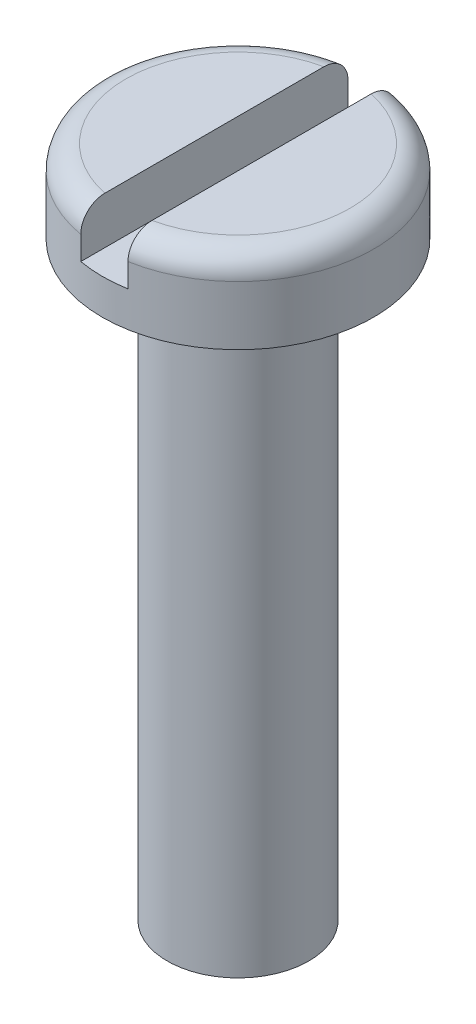
ISO-10303-21;
HEADER;
FILE_DESCRIPTION(('STEP AP214'),'2;1');
FILE_NAME('part.step','',(''),(''),'','','');
FILE_SCHEMA(('AUTOMOTIVE_DESIGN { 1 0 10303 214 1 1 1 1 }'));
ENDSEC;
DATA;
#1=APPLICATION_CONTEXT('core data for automotive mechanical design processes');
#2=APPLICATION_PROTOCOL_DEFINITION('international standard','automotive_design',2000,#1);
#3=PRODUCT_CONTEXT('',#1,'mechanical');
#4=PRODUCT('Part','Part','',(#3));
#5=PRODUCT_RELATED_PRODUCT_CATEGORY('part','',(#4));
#6=PRODUCT_DEFINITION_FORMATION('','',#4);
#7=PRODUCT_DEFINITION_CONTEXT('part definition',#1,'design');
#8=PRODUCT_DEFINITION('design','',#6,#7);
#9=PRODUCT_DEFINITION_SHAPE('','',#8);
#10=(LENGTH_UNIT() NAMED_UNIT(*) SI_UNIT(.MILLI.,.METRE.));
#11=(NAMED_UNIT(*) PLANE_ANGLE_UNIT() SI_UNIT($,.RADIAN.));
#12=(NAMED_UNIT(*) SI_UNIT($,.STERADIAN.) SOLID_ANGLE_UNIT());
#13=UNCERTAINTY_MEASURE_WITH_UNIT(LENGTH_MEASURE(1.E-05),#10,'distance_accuracy_value','');
#14=(GEOMETRIC_REPRESENTATION_CONTEXT(3) GLOBAL_UNCERTAINTY_ASSIGNED_CONTEXT((#13)) GLOBAL_UNIT_ASSIGNED_CONTEXT((#10,
#11,#12)) REPRESENTATION_CONTEXT('',''));
#15=CARTESIAN_POINT('',(0.,0.,0.));
#16=DIRECTION('',(0.,0.,1.));
#17=DIRECTION('',(1.,0.,0.));
#18=AXIS2_PLACEMENT_3D('',#15,#16,#17);
#19=CARTESIAN_POINT('',(0.,3.5,0.));
#20=DIRECTION('',(0.,1.,0.));
#21=DIRECTION('',(0.,0.,1.));
#22=AXIS2_PLACEMENT_3D('',#19,#20,#21);
#23=PLANE('',#22);
#24=DIRECTION('',(0.,0.,-1.));
#25=VECTOR('',#24,1.);
#26=CARTESIAN_POINT('',(0.999999999999999,3.5,-6.56842896440374));
#27=LINE('',#26,#25);
#28=CARTESIAN_POINT('',(1.,3.5,4.64354390525168));
#29=VERTEX_POINT('',#28);
#30=CARTESIAN_POINT('',(0.999999999999999,3.5,-4.64354390525168));
#31=VERTEX_POINT('',#30);
#32=EDGE_CURVE('E88',#29,#31,#27,.T.);
#33=ORIENTED_EDGE('',*,*,#32,.F.);
#34=CARTESIAN_POINT('',(0.,3.5,0.));
#35=DIRECTION('',(0.,1.,0.));
#36=DIRECTION('',(0.,0.,1.));
#37=AXIS2_PLACEMENT_3D('',#34,#35,#36);
#38=CIRCLE('',#37,4.75);
#39=EDGE_CURVE('E99',#29,#31,#38,.T.);
#40=ORIENTED_EDGE('',*,*,#39,.T.);
#41=EDGE_LOOP('',(#33,#40));
#42=FACE_BOUND('',#41,.T.);
#43=ADVANCED_FACE('F33',(#42),#23,.T.);
#44=CARTESIAN_POINT('',(0.,2.5,0.));
#45=DIRECTION('',(0.,1.,0.));
#46=DIRECTION('',(0.,0.,1.));
#47=AXIS2_PLACEMENT_3D('',#44,#45,#46);
#48=TOROIDAL_SURFACE('',#47,4.75,1.);
#49=CARTESIAN_POINT('',(0.999999999999999,3.06518472288821,-5.48454445175744));
#50=CARTESIAN_POINT('',(0.999999999999999,3.01954968627423,-5.51632168081333));
#51=CARTESIAN_POINT('',(0.999999999999999,2.97122176580344,-5.54429670384576));
#52=CARTESIAN_POINT('',(0.999999999999999,2.87052300378599,-5.59177173987451));
#53=CARTESIAN_POINT('',(0.999999999999999,2.81814798636274,-5.61126285771096));
#54=CARTESIAN_POINT('',(0.999999999999999,2.71086408957968,-5.64114752127945));
#55=CARTESIAN_POINT('',(0.999999999999999,2.65595551567557,-5.65154216071787));
#56=CARTESIAN_POINT('',(0.999999999999999,2.54518448016182,-5.66291240594177));
#57=CARTESIAN_POINT('',(0.999999999999999,2.4893222383615,-5.66389015361541));
#58=CARTESIAN_POINT('',(0.999999999999999,2.37849331439132,-5.65642085650966));
#59=CARTESIAN_POINT('',(0.999999999999999,2.32352367782358,-5.64801756400862));
#60=CARTESIAN_POINT('',(0.999999999999999,2.21577194946865,-5.62211242258252));
#61=CARTESIAN_POINT('',(0.999999999999999,2.16298991081687,-5.60461035279348));
#62=CARTESIAN_POINT('',(0.999999999999999,2.0610247759472,-5.56100743028041));
#63=CARTESIAN_POINT('',(0.999999999999999,2.01184658194587,-5.53489512123562));
#64=CARTESIAN_POINT('',(0.999999999999999,1.91851889314154,-5.47485766532985));
#65=CARTESIAN_POINT('',(0.999999999999999,1.8743695623989,-5.44093226368558));
#66=CARTESIAN_POINT('',(0.999999999999999,1.79189356351289,-5.36590889999613));
#67=CARTESIAN_POINT('',(0.999999999999999,1.75362545746599,-5.32474658423208));
#68=CARTESIAN_POINT('',(0.999999999999999,1.68441657733231,-5.23666738131402));
#69=CARTESIAN_POINT('',(0.999999999999999,1.6534763049241,-5.18975010049685));
#70=CARTESIAN_POINT('',(0.999999999999999,1.59927518364256,-5.0907155278223));
#71=CARTESIAN_POINT('',(0.999999999999999,1.57614195480095,-5.0385284077101));
#72=CARTESIAN_POINT('',(0.999999999999999,1.53878893274384,-4.93105755655334));
#73=CARTESIAN_POINT('',(0.999999999999999,1.52456998668383,-4.87577353174279));
#74=CARTESIAN_POINT('',(0.999999999999999,1.5051822533275,-4.76260232896777));
#75=CARTESIAN_POINT('',(0.999999999999999,1.50018316568881,-4.70468606884549));
#76=CARTESIAN_POINT('',(0.999999999999999,1.49982668625646,-4.58882312647553));
#77=CARTESIAN_POINT('',(0.999999999999999,1.50447021559167,-4.53087644185015));
#78=CARTESIAN_POINT('',(0.999999999999999,1.52337973144597,-4.41569637320298));
#79=CARTESIAN_POINT('',(0.999999999999999,1.53778624027629,-4.35848601566789));
#80=CARTESIAN_POINT('',(0.999999999999999,1.57596841394595,-4.24727784289789));
#81=CARTESIAN_POINT('',(0.999999999999999,1.59974460663811,-4.19328020885306));
#82=CARTESIAN_POINT('',(0.999999999999999,1.65612684731109,-4.08990418454262));
#83=CARTESIAN_POINT('',(1.,1.68875781142681,-4.04053936608148));
#84=CARTESIAN_POINT('',(1.,1.7619681588511,-3.94809741266671));
#85=CARTESIAN_POINT('',(1.,1.80254709277508,-3.90501992246271));
#86=CARTESIAN_POINT('',(1.,1.88985796269059,-3.82716906987331));
#87=CARTESIAN_POINT('',(1.,1.93648153337223,-3.79227430729834));
#88=CARTESIAN_POINT('',(1.,2.0350805603147,-3.73110761237692));
#89=CARTESIAN_POINT('',(1.,2.08705493349787,-3.7048339394914));
#90=CARTESIAN_POINT('',(1.,2.19312756687076,-3.66254850272995));
#91=CARTESIAN_POINT('',(1.,2.24710734092197,-3.64623953943972));
#92=CARTESIAN_POINT('',(1.,2.35707329143634,-3.62321416541616));
#93=CARTESIAN_POINT('',(1.,2.4130590648611,-3.61649583872142));
#94=CARTESIAN_POINT('',(1.,2.52374735074063,-3.61295578575569));
#95=CARTESIAN_POINT('',(1.,2.57844124925329,-3.61585890379303));
#96=CARTESIAN_POINT('',(1.,2.68655138587551,-3.63085110811072));
#97=CARTESIAN_POINT('',(1.,2.73996767930503,-3.64293979591295));
#98=CARTESIAN_POINT('',(1.,2.84381082030088,-3.67580475312142));
#99=CARTESIAN_POINT('',(1.,2.89424890871946,-3.69654560600705));
#100=CARTESIAN_POINT('',(1.,2.99103690637796,-3.74601752888342));
#101=CARTESIAN_POINT('',(1.,3.03738641527001,-3.77474938019994));
#102=CARTESIAN_POINT('',(1.,3.1258319672709,-3.84004665926685));
#103=CARTESIAN_POINT('',(1.,3.16780754779184,-3.87677513012849));
#104=CARTESIAN_POINT('',(1.,3.245239463632,-3.95655712734411));
#105=CARTESIAN_POINT('',(1.,3.28069474096664,-3.99961167813271));
#106=CARTESIAN_POINT('',(1.,3.34528001746797,-4.09232841088008));
#107=CARTESIAN_POINT('',(0.999999999999999,3.37416733856303,-4.14215971294858));
#108=CARTESIAN_POINT('',(0.999999999999999,3.42338411206135,-4.2458840316384));
#109=CARTESIAN_POINT('',(0.999999999999999,3.44371241891562,-4.29977759081982));
#110=CARTESIAN_POINT('',(0.999999999999999,3.47565661984185,-4.41142097380307));
#111=CARTESIAN_POINT('',(0.999999999999999,3.48706379065847,-4.46923063356689));
#112=CARTESIAN_POINT('',(0.999999999999999,3.50005928403218,-4.58594356511564));
#113=CARTESIAN_POINT('',(0.999999999999999,3.50164753355147,-4.64484684503218));
#114=CARTESIAN_POINT('',(0.999999999999999,3.49490165828981,-4.76233599074706));
#115=CARTESIAN_POINT('',(0.999999999999999,3.48652567543077,-4.82091947157813));
#116=CARTESIAN_POINT('',(0.999999999999999,3.45994341769148,-4.93583170908549));
#117=CARTESIAN_POINT('',(0.999999999999999,3.44173513251262,-4.99216000213859));
#118=CARTESIAN_POINT('',(0.999999999999999,3.39618095507857,-5.10029117723591));
#119=CARTESIAN_POINT('',(0.999999999999999,3.36893311099196,-5.15213539954179));
#120=CARTESIAN_POINT('',(0.999999999999999,3.30598358386524,-5.25034979661229));
#121=CARTESIAN_POINT('',(0.999999999999999,3.2702930014888,-5.29672704049399));
#122=CARTESIAN_POINT('',(0.999999999999999,3.2060377971303,-5.36674412105525));
#123=CARTESIAN_POINT('',(0.999999999999999,3.17969941018013,-5.39246165054664));
#124=CARTESIAN_POINT('',(0.999999999999999,3.12436141457548,-5.44085511998556));
#125=CARTESIAN_POINT('',(0.999999999999999,3.09536183958906,-5.46353109840438));
#126=CARTESIAN_POINT('',(0.999999999999999,3.06518472288821,-5.48454445175744));
#127=B_SPLINE_CURVE_WITH_KNOTS('',3,(#49,#50,#51,#52,#53,#54,#55,#56,#57,#58,#59,#60,#61,#62,
#63,#64,#65,#66,#67,#68,#69,#70,#71,#72,#73,#74,#75,#76,#77,#78,#79,#80,#81,#82,#83,#84,#85,#86,
#87,#88,#89,#90,#91,#92,#93,#94,#95,#96,#97,#98,#99,#100,#101,#102,#103,#104,#105,#106,#107,
#108,#109,#110,#111,#112,#113,#114,#115,#116,#117,#118,#119,#120,#121,#122,#123,#124,#125,#126),
.UNSPECIFIED.,.T.,.F.,(4,2,2,2,2,2,2,2,2,2,2,2,2,2,2,2,2,2,2,2,2,2,2,2,2,2,2,2,2,2,2,2,2,2,2,2,
2,2,4),(0.,0.166694107861553,0.333562571732808,0.500410969576235,0.667221416569529,
0.833257113838222,0.999296841650093,1.1655583905031,1.33182536187798,1.49965344402201,
1.66749301270237,1.83795653555284,2.00843625569365,2.18202364011152,2.35562760754893,
2.53178493708227,2.70795219207739,2.88462039251338,3.06127860686971,3.23512145829127,
3.4089291904032,3.57726158854158,3.74556035350755,3.90908808300962,4.07260871893973,
4.23546647221079,4.39834015462008,4.56491172225542,4.73151029399709,4.90351669462979,
5.07554610949784,5.25148909886218,5.42743339697243,5.60411942519863,5.78084159208583,
5.95570639731922,6.13034255271767,6.24057389146693,6.35080383581503),.UNSPECIFIED.);
#128=CARTESIAN_POINT('',(0.999999999999999,2.49999999999999,-5.66237582645312));
#129=VERTEX_POINT('',#128);
#130=EDGE_CURVE('E57',#31,#129,#127,.T.);
#131=ORIENTED_EDGE('',*,*,#130,.F.);
#132=ORIENTED_EDGE('',*,*,#39,.F.);
#133=CARTESIAN_POINT('',(1.,2.8326647865746,3.673269019709));
#134=CARTESIAN_POINT('',(1.,2.78160418972474,3.65460410322279));
#135=CARTESIAN_POINT('',(1.,2.7289524044354,3.64019236648399));
#136=CARTESIAN_POINT('',(1.,2.62194036875886,3.62040628208629));
#137=CARTESIAN_POINT('',(1.,2.56757863790559,3.61503999831094));
#138=CARTESIAN_POINT('',(1.,2.4587343795269,3.61355575372345));
#139=CARTESIAN_POINT('',(1.,2.40425187513427,3.61743615291304));
#140=CARTESIAN_POINT('',(1.,2.29672857257207,3.63430142555926));
#141=CARTESIAN_POINT('',(1.,2.24368754399618,3.64728483498838));
#142=CARTESIAN_POINT('',(1.,2.14054176555078,3.68188528826227));
#143=CARTESIAN_POINT('',(1.,2.09043532019463,3.70349728927779));
#144=CARTESIAN_POINT('',(1.,1.99444285081033,3.75463769775284));
#145=CARTESIAN_POINT('',(1.,1.94855736062124,3.78416710471084));
#146=CARTESIAN_POINT('',(1.,1.86112422958298,3.85101705830551));
#147=CARTESIAN_POINT('',(1.,1.81970519033674,3.88850568933757));
#148=CARTESIAN_POINT('',(1.,1.74350284303094,3.96970796529659));
#149=CARTESIAN_POINT('',(1.,1.70872060169851,4.01342260895688));
#150=CARTESIAN_POINT('',(1.,1.64560790486206,4.10736124217646));
#151=CARTESIAN_POINT('',(1.,1.61752283177031,4.15775017349401));
#152=CARTESIAN_POINT('',(1.,1.56999904390035,4.26245349459385));
#153=CARTESIAN_POINT('',(1.,1.5505614301598,4.31676838322573));
#154=CARTESIAN_POINT('',(1.,1.52050235948243,4.42906527703483));
#155=CARTESIAN_POINT('',(1.,1.510083090514,4.48710151431457));
#156=CARTESIAN_POINT('',(1.,1.49909676611875,4.60410169295462));
#157=CARTESIAN_POINT('',(1.,1.49853011562557,4.66306567234461));
#158=CARTESIAN_POINT('',(1.,1.50732926155367,4.78045293980136));
#159=CARTESIAN_POINT('',(1.,1.51672864055587,4.83887372628395));
#160=CARTESIAN_POINT('',(1.,1.54531782467399,4.95327136161427));
#161=CARTESIAN_POINT('',(1.,1.56450716493672,5.00924832636413));
#162=CARTESIAN_POINT('',(1.,1.61192370438645,5.11646239733099));
#163=CARTESIAN_POINT('',(1.,1.64004383028856,5.16774682728155));
#164=CARTESIAN_POINT('',(1.,1.7046463209554,5.26474891236169));
#165=CARTESIAN_POINT('',(1.,1.74112789285472,5.31046709467589));
#166=CARTESIAN_POINT('',(1.,1.82071004769905,5.39415318356009));
#167=CARTESIAN_POINT('',(1.,1.86367881933391,5.43224643497772));
#168=CARTESIAN_POINT('',(1.,1.95549694685948,5.50052666384639));
#169=CARTESIAN_POINT('',(1.,2.00434572281344,5.53071442007449));
#170=CARTESIAN_POINT('',(1.,2.10563280655275,5.58179324466809));
#171=CARTESIAN_POINT('',(1.,2.15799532299867,5.60283465783728));
#172=CARTESIAN_POINT('',(1.,2.26553430059302,5.63571277794843));
#173=CARTESIAN_POINT('',(1.,2.32071055712259,5.64755015320579));
#174=CARTESIAN_POINT('',(1.,2.43163411845388,5.66157055745761));
#175=CARTESIAN_POINT('',(1.,2.4873677100359,5.66386227459336));
#176=CARTESIAN_POINT('',(1.,2.59842270402975,5.65902004095649));
#177=CARTESIAN_POINT('',(1.,2.65374411997443,5.65188640102771));
#178=CARTESIAN_POINT('',(1.,2.76220687902079,5.62845394534112));
#179=CARTESIAN_POINT('',(1.,2.81535513102846,5.61218707083762));
#180=CARTESIAN_POINT('',(1.,2.91818543108895,5.5710037418584));
#181=CARTESIAN_POINT('',(1.,2.96786744156139,5.54608719362194));
#182=CARTESIAN_POINT('',(1.,3.0626324056155,5.48820433522764));
#183=CARTESIAN_POINT('',(1.,3.10769145436569,5.45519890858905));
#184=CARTESIAN_POINT('',(1.,3.1917132825968,5.38217703071166));
#185=CARTESIAN_POINT('',(1.,3.23067576034795,5.34216023267567));
#186=CARTESIAN_POINT('',(1.,3.30192909548467,5.25573424587449));
#187=CARTESIAN_POINT('',(1.,3.33413128742409,5.20925198228682));
#188=CARTESIAN_POINT('',(1.,3.39042881175002,5.111615176826));
#189=CARTESIAN_POINT('',(1.,3.41452345977318,5.06046024099253));
#190=CARTESIAN_POINT('',(1.,3.454370516218,4.9539860571052));
#191=CARTESIAN_POINT('',(1.,3.46997112307535,4.8986100063289));
#192=CARTESIAN_POINT('',(1.,3.49183179059921,4.78604448983152));
#193=CARTESIAN_POINT('',(1.,3.49809092129779,4.7288548441411));
#194=CARTESIAN_POINT('',(1.,3.50118686891251,4.61321015854489));
#195=CARTESIAN_POINT('',(1.,3.49785554668704,4.55475059135061));
#196=CARTESIAN_POINT('',(1.,3.48153696374702,4.43919502782423));
#197=CARTESIAN_POINT('',(1.,3.46854923385063,4.38209909788715));
#198=CARTESIAN_POINT('',(1.,3.43308877473464,4.27026362443103));
#199=CARTESIAN_POINT('',(1.,3.41051722039695,4.21555537458629));
#200=CARTESIAN_POINT('',(1.,3.3564628523867,4.11070929366436));
#201=CARTESIAN_POINT('',(1.,3.32497767185796,4.06057268118592));
#202=CARTESIAN_POINT('',(1.,3.25407838291162,3.96659558961349));
#203=CARTESIAN_POINT('',(1.,3.21469864615518,3.92272918234934));
#204=CARTESIAN_POINT('',(1.,3.12900072130486,3.84247179018299));
#205=CARTESIAN_POINT('',(1.,3.08269200907375,3.80607075457771));
#206=CARTESIAN_POINT('',(1.,3.00214427742354,3.75349276440668));
#207=CARTESIAN_POINT('',(1.,2.96955150861863,3.73474983131548));
#208=CARTESIAN_POINT('',(1.,2.90244713739333,3.70108452837992));
#209=CARTESIAN_POINT('',(1.,2.86793558311662,3.68616206272992));
#210=CARTESIAN_POINT('',(1.,2.8326647865746,3.673269019709));
#211=B_SPLINE_CURVE_WITH_KNOTS('',3,(#133,#134,#135,#136,#137,#138,#139,#140,#141,#142,#143,
#144,#145,#146,#147,#148,#149,#150,#151,#152,#153,#154,#155,#156,#157,#158,#159,#160,#161,#162,
#163,#164,#165,#166,#167,#168,#169,#170,#171,#172,#173,#174,#175,#176,#177,#178,#179,#180,#181,
#182,#183,#184,#185,#186,#187,#188,#189,#190,#191,#192,#193,#194,#195,#196,#197,#198,#199,#200,
#201,#202,#203,#204,#205,#206,#207,#208,#209,#210),.UNSPECIFIED.,.T.,.F.,(4,2,2,2,2,2,2,2,2,2,2,
2,2,2,2,2,2,2,2,2,2,2,2,2,2,2,2,2,2,2,2,2,2,2,2,2,2,2,4),(0.,0.162960578088863,
0.326066356366575,0.489143208240768,0.652193838651901,0.815149316142738,0.978125374932511,
1.14496449562325,1.31183040968349,1.48409955026561,1.65639061874117,1.83245114850479,
2.00851891417884,2.18518186751798,2.36183643321482,2.53644828906274,2.71104359436894,
2.88247750461158,3.05389452039578,3.22237618460375,3.39084561402811,3.55739149428451,
3.723931882073,3.88989343131247,4.05585677959813,4.22263910870833,4.3894296895536,
4.55828730489567,4.72715917005159,4.89895747851023,5.07077288879119,5.24561879997461,
5.42047320705972,5.59717619975367,5.77392615688863,5.94992266224638,6.12568064340079,
6.23825068571217,6.35081790483502),.UNSPECIFIED.);
#212=CARTESIAN_POINT('',(1.,2.5,5.66237582645306));
#213=VERTEX_POINT('',#212);
#214=EDGE_CURVE('E84',#213,#29,#211,.T.);
#215=ORIENTED_EDGE('',*,*,#214,.F.);
#216=CARTESIAN_POINT('',(0.,2.5,0.));
#217=DIRECTION('',(0.,1.,0.));
#218=DIRECTION('',(0.,0.,1.));
#219=AXIS2_PLACEMENT_3D('',#216,#217,#218);
#220=CIRCLE('',#219,5.75);
#221=EDGE_CURVE('E102',#129,#213,#220,.F.);
#222=ORIENTED_EDGE('',*,*,#221,.F.);
#223=EDGE_LOOP('',(#131,#132,#215,#222));
#224=FACE_BOUND('',#223,.T.);
#225=ADVANCED_FACE('F101',(#224),#48,.T.);
#226=CARTESIAN_POINT('',(0.,3.5,0.));
#227=DIRECTION('',(0.,-1.,0.));
#228=DIRECTION('',(0.,0.,-1.));
#229=AXIS2_PLACEMENT_3D('',#226,#227,#228);
#230=CYLINDRICAL_SURFACE('',#229,5.75);
#231=CARTESIAN_POINT('',(0.,1.5,0.));
#232=DIRECTION('',(0.,1.,0.));
#233=DIRECTION('',(0.,0.,1.));
#234=AXIS2_PLACEMENT_3D('',#231,#232,#233);
#235=CIRCLE('',#234,5.75);
#236=CARTESIAN_POINT('',(0.999999999999999,1.5,-5.66237582645306));
#237=VERTEX_POINT('',#236);
#238=CARTESIAN_POINT('',(-1.,1.5,-5.66237582645306));
#239=VERTEX_POINT('',#238);
#240=EDGE_CURVE('E11',#237,#239,#235,.T.);
#241=ORIENTED_EDGE('',*,*,#240,.F.);
#242=DIRECTION('',(0.,-1.,0.));
#243=VECTOR('',#242,1.);
#244=CARTESIAN_POINT('',(0.999999999999999,3.5,-5.66237582645306));
#245=LINE('',#244,#243);
#246=EDGE_CURVE('E152',#237,#129,#245,.F.);
#247=ORIENTED_EDGE('',*,*,#246,.T.);
#248=ORIENTED_EDGE('',*,*,#221,.T.);
#249=DIRECTION('',(0.,-1.,0.));
#250=VECTOR('',#249,1.);
#251=CARTESIAN_POINT('',(1.,3.5,5.66237582645306));
#252=LINE('',#251,#250);
#253=CARTESIAN_POINT('',(1.,1.5,5.66237582645306));
#254=VERTEX_POINT('',#253);
#255=EDGE_CURVE('E90',#213,#254,#252,.T.);
#256=ORIENTED_EDGE('',*,*,#255,.T.);
#257=CARTESIAN_POINT('',(-0.999999999999999,1.5,5.66237582645306));
#258=VERTEX_POINT('',#257);
#259=EDGE_CURVE('E38',#258,#254,#235,.T.);
#260=ORIENTED_EDGE('',*,*,#259,.F.);
#261=DIRECTION('',(0.,-1.,0.));
#262=VECTOR('',#261,1.);
#263=CARTESIAN_POINT('',(-0.999999999999999,3.5,5.66237582645306));
#264=LINE('',#263,#262);
#265=CARTESIAN_POINT('',(-0.999999999999999,2.50000000000007,5.66237582645354));
#266=VERTEX_POINT('',#265);
#267=EDGE_CURVE('E161',#258,#266,#264,.F.);
#268=ORIENTED_EDGE('',*,*,#267,.T.);
#269=CARTESIAN_POINT('',(-1.,2.50000000000002,-5.66237582645317));
#270=VERTEX_POINT('',#269);
#271=EDGE_CURVE('E105',#266,#270,#220,.F.);
#272=ORIENTED_EDGE('',*,*,#271,.T.);
#273=DIRECTION('',(0.,-1.,0.));
#274=VECTOR('',#273,1.);
#275=CARTESIAN_POINT('',(-1.,3.5,-5.66237582645306));
#276=LINE('',#275,#274);
#277=EDGE_CURVE('E156',#270,#239,#276,.T.);
#278=ORIENTED_EDGE('',*,*,#277,.T.);
#279=EDGE_LOOP('',(#241,#247,#248,#256,#260,#268,#272,#278));
#280=FACE_BOUND('',#279,.T.);
#281=CARTESIAN_POINT('',(0.,0.,0.));
#282=DIRECTION('',(0.,1.,0.));
#283=DIRECTION('',(0.,0.,1.));
#284=AXIS2_PLACEMENT_3D('',#281,#282,#283);
#285=CIRCLE('',#284,5.75);
#286=CARTESIAN_POINT('',(0.,0.,5.75));
#287=VERTEX_POINT('',#286);
#288=EDGE_CURVE('E110',#287,#287,#285,.T.);
#289=ORIENTED_EDGE('',*,*,#288,.T.);
#290=EDGE_LOOP('',(#289));
#291=FACE_BOUND('',#290,.T.);
#292=ADVANCED_FACE('F154',(#280,#291),#230,.T.);
#293=DIRECTION('',(0.,0.,1.));
#294=VECTOR('',#293,1.);
#295=CARTESIAN_POINT('',(-1.,3.5,-6.56842896440374));
#296=LINE('',#295,#294);
#297=CARTESIAN_POINT('',(-1.,3.5,-4.64354390525168));
#298=VERTEX_POINT('',#297);
#299=CARTESIAN_POINT('',(-0.999999999999999,3.5,4.64354390525168));
#300=VERTEX_POINT('',#299);
#301=EDGE_CURVE('E49',#298,#300,#296,.T.);
#302=ORIENTED_EDGE('',*,*,#301,.F.);
#303=EDGE_CURVE('E103',#298,#300,#38,.T.);
#304=ORIENTED_EDGE('',*,*,#303,.T.);
#305=EDGE_LOOP('',(#302,#304));
#306=FACE_BOUND('',#305,.T.);
#307=ADVANCED_FACE('F175',(#306),#23,.T.);
#308=CARTESIAN_POINT('',(0.,0.,0.));
#309=DIRECTION('',(0.,1.,0.));
#310=DIRECTION('',(0.,0.,1.));
#311=AXIS2_PLACEMENT_3D('',#308,#309,#310);
#312=PLANE('',#311);
#313=CARTESIAN_POINT('',(0.,0.,0.));
#314=DIRECTION('',(0.,-1.,0.));
#315=DIRECTION('',(0.,0.,-1.));
#316=AXIS2_PLACEMENT_3D('',#313,#314,#315);
#317=CIRCLE('',#316,3.);
#318=CARTESIAN_POINT('',(0.,0.,-3.));
#319=VERTEX_POINT('',#318);
#320=EDGE_CURVE('E108',#319,#319,#317,.T.);
#321=ORIENTED_EDGE('',*,*,#320,.F.);
#322=EDGE_LOOP('',(#321));
#323=FACE_BOUND('',#322,.T.);
#324=ORIENTED_EDGE('',*,*,#288,.F.);
#325=EDGE_LOOP('',(#324));
#326=FACE_BOUND('',#325,.T.);
#327=ADVANCED_FACE('F172',(#323,#326),#312,.F.);
#328=CARTESIAN_POINT('',(0.,-25.,0.));
#329=DIRECTION('',(0.,1.,0.));
#330=DIRECTION('',(0.,0.,1.));
#331=AXIS2_PLACEMENT_3D('',#328,#329,#330);
#332=CYLINDRICAL_SURFACE('',#331,3.);
#333=CARTESIAN_POINT('',(0.,-25.,0.));
#334=DIRECTION('',(0.,-1.,0.));
#335=DIRECTION('',(0.,0.,-1.));
#336=AXIS2_PLACEMENT_3D('',#333,#334,#335);
#337=CIRCLE('',#336,3.);
#338=CARTESIAN_POINT('',(0.,-25.,-3.));
#339=VERTEX_POINT('',#338);
#340=EDGE_CURVE('E158',#339,#339,#337,.T.);
#341=ORIENTED_EDGE('',*,*,#340,.F.);
#342=EDGE_LOOP('',(#341));
#343=FACE_BOUND('',#342,.T.);
#344=ORIENTED_EDGE('',*,*,#320,.T.);
#345=EDGE_LOOP('',(#344));
#346=FACE_BOUND('',#345,.T.);
#347=ADVANCED_FACE('F174',(#343,#346),#332,.T.);
#348=CARTESIAN_POINT('',(0.,-25.,0.));
#349=DIRECTION('',(0.,-1.,0.));
#350=DIRECTION('',(0.,0.,-1.));
#351=AXIS2_PLACEMENT_3D('',#348,#349,#350);
#352=PLANE('',#351);
#353=ORIENTED_EDGE('',*,*,#340,.T.);
#354=EDGE_LOOP('',(#353));
#355=FACE_BOUND('',#354,.T.);
#356=ADVANCED_FACE('F133',(#355),#352,.T.);
#357=CARTESIAN_POINT('',(-1.,3.06518472288821,-5.48454445175744));
#358=CARTESIAN_POINT('',(-1.,3.11176212059754,-5.45210471578195));
#359=CARTESIAN_POINT('',(-1.,3.15560243885028,-5.41565495320652));
#360=CARTESIAN_POINT('',(-1.,3.23654302668367,-5.33584910720498));
#361=CARTESIAN_POINT('',(-1.,3.27363386573916,-5.29248351707516));
#362=CARTESIAN_POINT('',(-1.,3.3399979394156,-5.20021412103601));
#363=CARTESIAN_POINT('',(-1.,3.36928071843041,-5.15131718167527));
#364=CARTESIAN_POINT('',(-1.,3.41933613066635,-5.04936856233181));
#365=CARTESIAN_POINT('',(-1.,3.44011084848699,-4.99631790387013));
#366=CARTESIAN_POINT('',(-1.,3.47289383996715,-4.88679693598571));
#367=CARTESIAN_POINT('',(-1.,3.48478054128979,-4.83029024946014));
#368=CARTESIAN_POINT('',(-1.,3.49907199701993,-4.7160878032578));
#369=CARTESIAN_POINT('',(-1.,3.50147541948508,-4.65839187769427));
#370=CARTESIAN_POINT('',(-1.,3.49674608008262,-4.54241358937509));
#371=CARTESIAN_POINT('',(-1.,3.48945147360319,-4.48413779388991));
#372=CARTESIAN_POINT('',(-1.,3.46526768520951,-4.36960940082394));
#373=CARTESIAN_POINT('',(-1.,3.44837777379262,-4.31335695741842));
#374=CARTESIAN_POINT('',(-1.,3.40527739041368,-4.20400452621096));
#375=CARTESIAN_POINT('',(-1.,3.37899157609885,-4.15093419323591));
#376=CARTESIAN_POINT('',(-1.,3.31781081741959,-4.05000590762994));
#377=CARTESIAN_POINT('',(-1.,3.28291594087549,-4.00214791394161));
#378=CARTESIAN_POINT('',(-1.,3.20577141200189,-3.91350317376988));
#379=CARTESIAN_POINT('',(-1.,3.1635881936592,-3.87265868166759));
#380=CARTESIAN_POINT('',(-1.,3.0727966461121,-3.79886881194158));
#381=CARTESIAN_POINT('',(-1.,3.02418931006756,-3.76592221552482));
#382=CARTESIAN_POINT('',(-1.,2.92332787739494,-3.70985999734227));
#383=CARTESIAN_POINT('',(-1.,2.8712089904301,-3.68650127656801));
#384=CARTESIAN_POINT('',(-1.,2.76370475480245,-3.64920056600916));
#385=CARTESIAN_POINT('',(-1.,2.7083201470768,-3.63525644907977));
#386=CARTESIAN_POINT('',(-1.,2.59778411861345,-3.61760499495843));
#387=CARTESIAN_POINT('',(-1.,2.54268309484262,-3.61358114837913));
#388=CARTESIAN_POINT('',(-1.,2.4326058283571,-3.61499339994923));
#389=CARTESIAN_POINT('',(-1.,2.37762957293232,-3.62042848682095));
#390=CARTESIAN_POINT('',(-1.,2.27019250484157,-3.64040800815204));
#391=CARTESIAN_POINT('',(-1.,2.21770675271555,-3.65481896950892));
#392=CARTESIAN_POINT('',(-1.,2.11584777304479,-3.6921274209174));
#393=CARTESIAN_POINT('',(-1.,2.06647471578318,-3.71502537478797));
#394=CARTESIAN_POINT('',(-1.,1.97145902119793,-3.76893975860593));
#395=CARTESIAN_POINT('',(-1.,1.9258790246943,-3.8000664362751));
#396=CARTESIAN_POINT('',(-1.,1.84038527177443,-3.86931164061042));
#397=CARTESIAN_POINT('',(-1.,1.80047235743731,-3.9074312044339));
#398=CARTESIAN_POINT('',(-1.,1.7261132114974,-3.99085861925205));
#399=CARTESIAN_POINT('',(-1.,1.69187816538853,-4.0363547057736));
#400=CARTESIAN_POINT('',(-1.,1.63128312127804,-4.13231938600739));
#401=CARTESIAN_POINT('',(-1.,1.60492431918969,-4.18278873330421));
#402=CARTESIAN_POINT('',(-1.,1.56010152212786,-4.28879623235792));
#403=CARTESIAN_POINT('',(-1.,1.54187939818204,-4.34443677882253));
#404=CARTESIAN_POINT('',(-1.,1.51491609222536,-4.45797161298026));
#405=CARTESIAN_POINT('',(-1.,1.50617567704937,-4.51586608256764));
#406=CARTESIAN_POINT('',(-1.,1.49839361149557,-4.63296055851748));
#407=CARTESIAN_POINT('',(-1.,1.49946184088037,-4.69216792473317));
#408=CARTESIAN_POINT('',(-1.,1.51158618897415,-4.80955378360998));
#409=CARTESIAN_POINT('',(-1.,1.52264215545707,-4.86773229193845));
#410=CARTESIAN_POINT('',(-1.,1.55440033602747,-4.98100613191585));
#411=CARTESIAN_POINT('',(-1.,1.5750419434564,-5.03611843330004));
#412=CARTESIAN_POINT('',(-1.,1.62543643450329,-5.14200966665345));
#413=CARTESIAN_POINT('',(-1.,1.65518860076925,-5.1927889393966));
#414=CARTESIAN_POINT('',(-1.,1.72244613626164,-5.28767237773623));
#415=CARTESIAN_POINT('',(-1.,1.75981612446878,-5.33187248735049));
#416=CARTESIAN_POINT('',(-1.,1.84157113586636,-5.41322506058091));
#417=CARTESIAN_POINT('',(-1.,1.88595545888622,-5.45037822680907));
#418=CARTESIAN_POINT('',(-1.,1.97960375808508,-5.51586821649288));
#419=CARTESIAN_POINT('',(-1.,2.02876385232463,-5.54435361611574));
#420=CARTESIAN_POINT('',(-1.,2.13121804051472,-5.59252773935859));
#421=CARTESIAN_POINT('',(-1.,2.18451160989527,-5.61221757706665));
#422=CARTESIAN_POINT('',(-1.,2.29289931982748,-5.64197057382158));
#423=CARTESIAN_POINT('',(-1.,2.34795680017392,-5.65216740625714));
#424=CARTESIAN_POINT('',(-1.,2.4590181628391,-5.66310318796989));
#425=CARTESIAN_POINT('',(-1.,2.51502224002216,-5.66384016552202));
#426=CARTESIAN_POINT('',(-1.,2.62598167485191,-5.65585774872708));
#427=CARTESIAN_POINT('',(-1.,2.68094146493675,-5.64719926255519));
#428=CARTESIAN_POINT('',(-1.,2.78857978228993,-5.62078955475338));
#429=CARTESIAN_POINT('',(-1.,2.84126108863941,-5.60304976945307));
#430=CARTESIAN_POINT('',(-1.,2.92243216346665,-5.56791037328364));
#431=CARTESIAN_POINT('',(-1.,2.95213416174155,-5.55324026424402));
#432=CARTESIAN_POINT('',(-1.,3.00992928212399,-5.5210161501351));
#433=CARTESIAN_POINT('',(-1.,3.03802241734751,-5.50346216858062));
#434=CARTESIAN_POINT('',(-1.,3.06518472288821,-5.48454445175744));
#435=B_SPLINE_CURVE_WITH_KNOTS('',3,(#357,#358,#359,#360,#361,#362,#363,#364,#365,#366,#367,
#368,#369,#370,#371,#372,#373,#374,#375,#376,#377,#378,#379,#380,#381,#382,#383,#384,#385,#386,
#387,#388,#389,#390,#391,#392,#393,#394,#395,#396,#397,#398,#399,#400,#401,#402,#403,#404,#405,
#406,#407,#408,#409,#410,#411,#412,#413,#414,#415,#416,#417,#418,#419,#420,#421,#422,#423,#424,
#425,#426,#427,#428,#429,#430,#431,#432,#433,#434),.UNSPECIFIED.,.T.,.F.,(4,2,2,2,2,2,2,2,2,2,2,
2,2,2,2,2,2,2,2,2,2,2,2,2,2,2,2,2,2,2,2,2,2,2,2,2,2,2,4),(0.,0.170159066475442,0.34055408750663,
0.510739856659413,0.680883902825694,0.853314661531243,1.0257696375627,1.20113904271008,
1.37652178245897,1.55334361936088,1.7301640633429,1.90545047288566,2.08070981501793,
2.25120053961178,2.42165273046222,2.58659184481215,2.75151332620168,2.91403908891353,
3.07657373506065,3.24140728852707,3.40626530925125,3.57630357496144,3.74636764584031,
3.92119625325885,4.09603899891794,4.2728427610951,4.4496438285994,4.62534195414027,
4.80102624902506,4.97382476631792,5.14660604575288,5.31623285695013,5.48583817630508,
5.6530174236544,5.82023151574118,5.98636804627316,6.15229586931626,6.25152748092402,
6.35075828344691),.UNSPECIFIED.);
#436=EDGE_CURVE('E95',#270,#298,#435,.T.);
#437=ORIENTED_EDGE('',*,*,#436,.F.);
#438=ORIENTED_EDGE('',*,*,#271,.F.);
#439=CARTESIAN_POINT('',(-1.,2.8326647865746,3.673269019709));
#440=CARTESIAN_POINT('',(-1.,2.88559113339257,3.69262170926228));
#441=CARTESIAN_POINT('',(-1.,2.93688670809257,3.71657460332521));
#442=CARTESIAN_POINT('',(-1.,3.03472510301058,3.7728469511375));
#443=CARTESIAN_POINT('',(-1.,3.08126039112315,3.8051793865721));
#444=CARTESIAN_POINT('',(-1.,3.16821139415205,3.87707595778733));
#445=CARTESIAN_POINT('',(-1.,3.20863838859252,3.91662645889265));
#446=CARTESIAN_POINT('',(-1.,3.28245476994726,4.00179556360832));
#447=CARTESIAN_POINT('',(-1.,3.31584584472038,4.04741270758843));
#448=CARTESIAN_POINT('',(-1.,3.37550862120114,4.14459002254836));
#449=CARTESIAN_POINT('',(-0.999999999999999,3.40159230706699,4.1962656511683));
#450=CARTESIAN_POINT('',(-0.999999999999999,3.44491159175658,4.30320558980311));
#451=CARTESIAN_POINT('',(-0.999999999999999,3.46214575543485,4.35847048026007));
#452=CARTESIAN_POINT('',(-0.999999999999999,3.48756505381743,4.47220021203781));
#453=CARTESIAN_POINT('',(-0.999999999999999,3.49556395562486,4.5307067780492));
#454=CARTESIAN_POINT('',(-0.999999999999999,3.50164127795832,4.64823554992102));
#455=CARTESIAN_POINT('',(-0.999999999999999,3.4997194169173,4.70725777036911));
#456=CARTESIAN_POINT('',(-0.999999999999999,3.48594489746132,4.82420499682962));
#457=CARTESIAN_POINT('',(-0.999999999999999,3.47408083914855,4.88212866522136));
#458=CARTESIAN_POINT('',(-0.999999999999999,3.44066928872718,4.99511508486999));
#459=CARTESIAN_POINT('',(-0.999999999999999,3.41912236595468,5.05017800412176));
#460=CARTESIAN_POINT('',(-0.999999999999999,3.36722839225058,5.15510889431306));
#461=CARTESIAN_POINT('',(-0.999999999999999,3.33699807563075,5.20503456650611));
#462=CARTESIAN_POINT('',(-0.999999999999999,3.26843676831074,5.29897622663686));
#463=CARTESIAN_POINT('',(-0.999999999999999,3.23010655545819,5.3429927813745));
#464=CARTESIAN_POINT('',(-0.999999999999999,3.14718896452942,5.42300530494685));
#465=CARTESIAN_POINT('',(-0.999999999999999,3.10272926049827,5.45913358705496));
#466=CARTESIAN_POINT('',(-0.999999999999999,3.00828986782324,5.52326242081918));
#467=CARTESIAN_POINT('',(-0.999999999999999,2.95831071555675,5.55126376128985));
#468=CARTESIAN_POINT('',(-0.999999999999999,2.85514856482147,5.5978678333279));
#469=CARTESIAN_POINT('',(-0.999999999999999,2.80203257616918,5.61661895928074));
#470=CARTESIAN_POINT('',(-0.999999999999999,2.69338851294401,5.64483091236268));
#471=CARTESIAN_POINT('',(-0.999999999999999,2.63786060267454,5.65429237128337));
#472=CARTESIAN_POINT('',(-0.999999999999999,2.5265943649834,5.66358166993231));
#473=CARTESIAN_POINT('',(-0.999999999999999,2.47086437703432,5.66350967531907));
#474=CARTESIAN_POINT('',(-0.999999999999999,2.36021321759018,5.65398485435055));
#475=CARTESIAN_POINT('',(-0.999999999999999,2.30529202387545,5.64453228619357));
#476=CARTESIAN_POINT('',(-0.999999999999999,2.19795029471333,5.61657000477839));
#477=CARTESIAN_POINT('',(-0.999999999999999,2.14552402830508,5.59808226927652));
#478=CARTESIAN_POINT('',(-0.999999999999999,2.04449379601182,5.55261783901865));
#479=CARTESIAN_POINT('',(-0.999999999999999,1.99588989040875,5.52564101041584));
#480=CARTESIAN_POINT('',(-0.999999999999999,1.90355931632558,5.46381535738033));
#481=CARTESIAN_POINT('',(-0.999999999999999,1.85986336958574,5.42892067525423));
#482=CARTESIAN_POINT('',(-0.999999999999999,1.7788561606452,5.35237760721016));
#483=CARTESIAN_POINT('',(-0.999999999999999,1.74154524963761,5.3107288500462));
#484=CARTESIAN_POINT('',(-0.999999999999999,1.67382779324948,5.2212843508765));
#485=CARTESIAN_POINT('',(-0.999999999999999,1.64351876648072,5.17341480238225));
#486=CARTESIAN_POINT('',(-0.999999999999999,1.59120711173059,5.07333599743743));
#487=CARTESIAN_POINT('',(-0.999999999999999,1.56920519712431,5.02112636875105));
#488=CARTESIAN_POINT('',(-0.999999999999999,1.53371676767146,4.91286581695664));
#489=CARTESIAN_POINT('',(-0.999999999999999,1.5203876127755,4.85676331454719));
#490=CARTESIAN_POINT('',(-0.999999999999999,1.50316232375164,4.74312882589021));
#491=CARTESIAN_POINT('',(-0.999999999999999,1.49926711008081,4.68559670070948));
#492=CARTESIAN_POINT('',(-0.999999999999999,1.50097438014392,4.56968204364767));
#493=CARTESIAN_POINT('',(-0.999999999999999,1.50674136806739,4.5113019040715));
#494=CARTESIAN_POINT('',(-0.999999999999999,1.52789879562215,4.39630953268932));
#495=CARTESIAN_POINT('',(-0.999999999999999,1.54329003498343,4.33969744821086));
#496=CARTESIAN_POINT('',(-0.999999999999999,1.58346588250191,4.22931515624998));
#497=CARTESIAN_POINT('',(-0.999999999999999,1.60833560008222,4.17557588276047));
#498=CARTESIAN_POINT('',(-0.999999999999999,1.66680426261341,4.07307011123215));
#499=CARTESIAN_POINT('',(-1.,1.70040325208091,4.02430363855487));
#500=CARTESIAN_POINT('',(-1.,1.77518207762763,3.93355448066827));
#501=CARTESIAN_POINT('',(-1.,1.81630617691641,3.89152592334928));
#502=CARTESIAN_POINT('',(-1.,1.90519057443665,3.81519318115756));
#503=CARTESIAN_POINT('',(-1.,1.95294964799161,3.78088757384607));
#504=CARTESIAN_POINT('',(-1.,2.05243442267249,3.72197280475124));
#505=CARTESIAN_POINT('',(-1.,2.10402385543167,3.69713368374075));
#506=CARTESIAN_POINT('',(-1.,2.21075167053787,3.65680029955078));
#507=CARTESIAN_POINT('',(-1.,2.26589019182822,3.64130640247419));
#508=CARTESIAN_POINT('',(-1.,2.37621367234752,3.62059928668571));
#509=CARTESIAN_POINT('',(-1.,2.43133972170654,3.61507046399757));
#510=CARTESIAN_POINT('',(-1.,2.54167310787389,3.6135346050484));
#511=CARTESIAN_POINT('',(-1.,2.59688021985135,3.61751412920155));
#512=CARTESIAN_POINT('',(-1.,2.68220209821062,3.63105591087815));
#513=CARTESIAN_POINT('',(-1.,2.71285148859819,3.6374628363607));
#514=CARTESIAN_POINT('',(-1.,2.77338973992215,3.6531968719379));
#515=CARTESIAN_POINT('',(-1.,2.8032786284003,3.66252387611792));
#516=CARTESIAN_POINT('',(-1.,2.8326647865746,3.673269019709));
#517=B_SPLINE_CURVE_WITH_KNOTS('',3,(#439,#440,#441,#442,#443,#444,#445,#446,#447,#448,#449,
#450,#451,#452,#453,#454,#455,#456,#457,#458,#459,#460,#461,#462,#463,#464,#465,#466,#467,#468,
#469,#470,#471,#472,#473,#474,#475,#476,#477,#478,#479,#480,#481,#482,#483,#484,#485,#486,#487,
#488,#489,#490,#491,#492,#493,#494,#495,#496,#497,#498,#499,#500,#501,#502,#503,#504,#505,#506,
#507,#508,#509,#510,#511,#512,#513,#514,#515,#516),.UNSPECIFIED.,.T.,.F.,(4,2,2,2,2,2,2,2,2,2,2,
2,2,2,2,2,2,2,2,2,2,2,2,2,2,2,2,2,2,2,2,2,2,2,2,2,2,2,4),(0.,0.168941799244411,
0.338146906134308,0.507035637851395,0.675883808318814,0.848743986261996,1.02163218845417,
1.19794900672554,1.37427082917658,1.55079510239006,1.72730899763177,1.90155290074112,
2.07578007849229,2.24681136020949,2.41782603578869,2.58599997908287,2.75416248405046,
2.9205582884705,3.08694951300842,3.25293799570839,3.41892909566593,3.58590727915582,
3.75289464391804,3.92208370034743,4.09128728262184,4.26348111467165,4.43569174676761,
4.61086424858192,4.78605130834121,4.96284995722388,5.13964950774336,5.3151889757249,
5.49069608576006,5.66161688009024,5.83254436987625,5.99795637765532,6.16313472194841,
6.25693924066127,6.35074035737015),.UNSPECIFIED.);
#518=EDGE_CURVE('E114',#300,#266,#517,.T.);
#519=ORIENTED_EDGE('',*,*,#518,.F.);
#520=ORIENTED_EDGE('',*,*,#303,.F.);
#521=EDGE_LOOP('',(#437,#438,#519,#520));
#522=FACE_BOUND('',#521,.T.);
#523=ADVANCED_FACE('F35',(#522),#48,.T.);
#524=CARTESIAN_POINT('',(0.,1.5,0.));
#525=DIRECTION('',(0.,1.,0.));
#526=DIRECTION('',(0.,0.,1.));
#527=AXIS2_PLACEMENT_3D('',#524,#525,#526);
#528=PLANE('',#527);
#529=ORIENTED_EDGE('',*,*,#240,.T.);
#530=DIRECTION('',(0.,0.,1.));
#531=VECTOR('',#530,1.);
#532=CARTESIAN_POINT('',(-1.,1.5,-6.56842896440374));
#533=LINE('',#532,#531);
#534=EDGE_CURVE('E149',#239,#258,#533,.T.);
#535=ORIENTED_EDGE('',*,*,#534,.T.);
#536=ORIENTED_EDGE('',*,*,#259,.T.);
#537=DIRECTION('',(0.,0.,-1.));
#538=VECTOR('',#537,1.);
#539=CARTESIAN_POINT('',(0.999999999999999,1.5,-6.56842896440374));
#540=LINE('',#539,#538);
#541=EDGE_CURVE('E146',#254,#237,#540,.T.);
#542=ORIENTED_EDGE('',*,*,#541,.T.);
#543=EDGE_LOOP('',(#529,#535,#536,#542));
#544=FACE_BOUND('',#543,.T.);
#545=ADVANCED_FACE('F128',(#544),#528,.T.);
#546=CARTESIAN_POINT('',(0.999999999999999,1.5,-6.56842896440374));
#547=DIRECTION('',(1.,0.,0.));
#548=DIRECTION('',(0.,0.,-1.));
#549=AXIS2_PLACEMENT_3D('',#546,#547,#548);
#550=PLANE('',#549);
#551=ORIENTED_EDGE('',*,*,#541,.F.);
#552=ORIENTED_EDGE('',*,*,#255,.F.);
#553=ORIENTED_EDGE('',*,*,#214,.T.);
#554=ORIENTED_EDGE('',*,*,#32,.T.);
#555=ORIENTED_EDGE('',*,*,#130,.T.);
#556=ORIENTED_EDGE('',*,*,#246,.F.);
#557=EDGE_LOOP('',(#551,#552,#553,#554,#555,#556));
#558=FACE_BOUND('',#557,.T.);
#559=ADVANCED_FACE('F87',(#558),#550,.F.);
#560=CARTESIAN_POINT('',(-1.,1.5,-6.56842896440374));
#561=DIRECTION('',(-1.,0.,0.));
#562=DIRECTION('',(0.,0.,1.));
#563=AXIS2_PLACEMENT_3D('',#560,#561,#562);
#564=PLANE('',#563);
#565=ORIENTED_EDGE('',*,*,#436,.T.);
#566=ORIENTED_EDGE('',*,*,#301,.T.);
#567=ORIENTED_EDGE('',*,*,#518,.T.);
#568=ORIENTED_EDGE('',*,*,#267,.F.);
#569=ORIENTED_EDGE('',*,*,#534,.F.);
#570=ORIENTED_EDGE('',*,*,#277,.F.);
#571=EDGE_LOOP('',(#565,#566,#567,#568,#569,#570));
#572=FACE_BOUND('',#571,.T.);
#573=ADVANCED_FACE('F123',(#572),#564,.F.);
#574=CLOSED_SHELL('',(#43,#225,#292,#307,#327,#347,#356,#523,#545,#559,#573));
#575=MANIFOLD_SOLID_BREP('B2',#574);
#576=ADVANCED_BREP_SHAPE_REPRESENTATION('',(#18,#575),#14);
#577=SHAPE_DEFINITION_REPRESENTATION(#9,#576);
ENDSEC;
END-ISO-10303-21;
